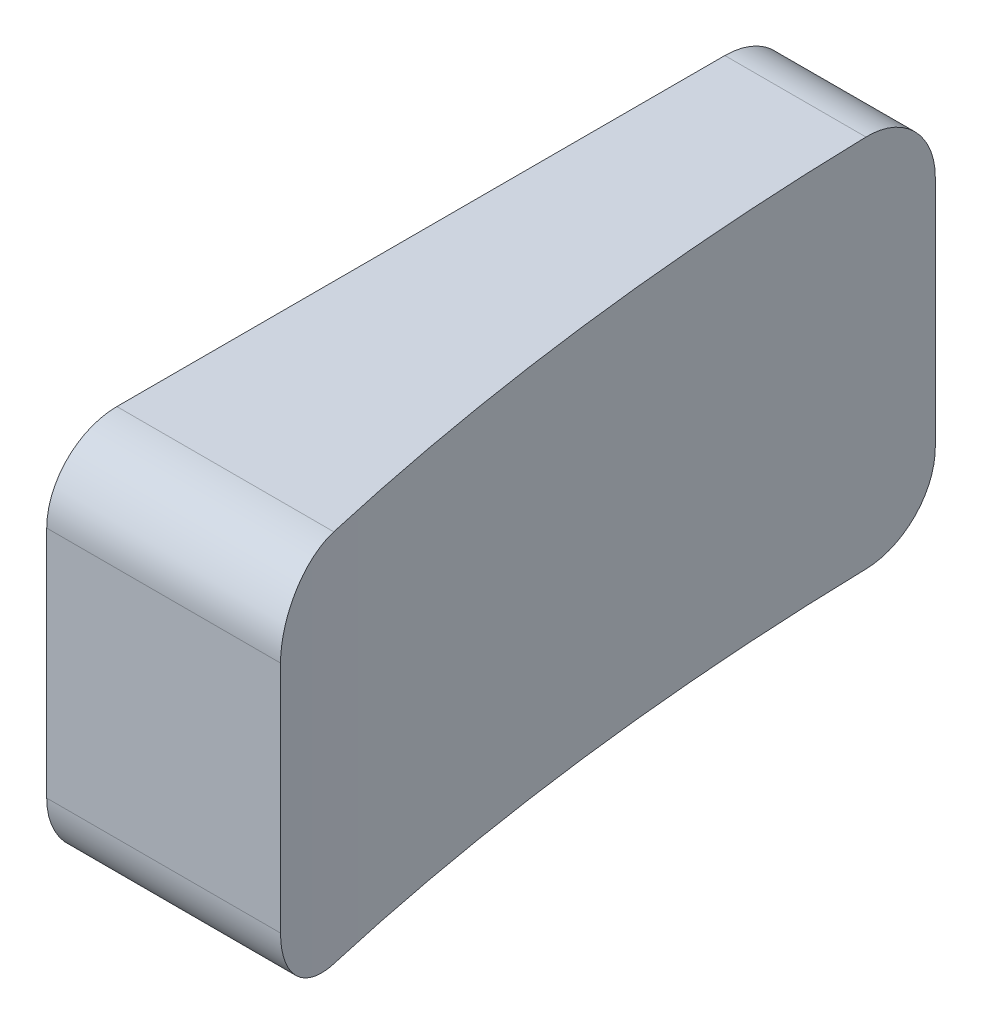
ISO-10303-21;
HEADER;
FILE_DESCRIPTION(('STEP AP214'),'2;1');
FILE_NAME('part.step','',(''),(''),'','','');
FILE_SCHEMA(('AUTOMOTIVE_DESIGN { 1 0 10303 214 1 1 1 1 }'));
ENDSEC;
DATA;
#1=APPLICATION_CONTEXT('core data for automotive mechanical design processes');
#2=APPLICATION_PROTOCOL_DEFINITION('international standard','automotive_design',2000,#1);
#3=PRODUCT_CONTEXT('',#1,'mechanical');
#4=PRODUCT('Part','Part','',(#3));
#5=PRODUCT_RELATED_PRODUCT_CATEGORY('part','',(#4));
#6=PRODUCT_DEFINITION_FORMATION('','',#4);
#7=PRODUCT_DEFINITION_CONTEXT('part definition',#1,'design');
#8=PRODUCT_DEFINITION('design','',#6,#7);
#9=PRODUCT_DEFINITION_SHAPE('','',#8);
#10=(LENGTH_UNIT() NAMED_UNIT(*) SI_UNIT(.MILLI.,.METRE.));
#11=(NAMED_UNIT(*) PLANE_ANGLE_UNIT() SI_UNIT($,.RADIAN.));
#12=(NAMED_UNIT(*) SI_UNIT($,.STERADIAN.) SOLID_ANGLE_UNIT());
#13=UNCERTAINTY_MEASURE_WITH_UNIT(LENGTH_MEASURE(1.E-05),#10,'distance_accuracy_value','');
#14=(GEOMETRIC_REPRESENTATION_CONTEXT(3) GLOBAL_UNCERTAINTY_ASSIGNED_CONTEXT((#13)) GLOBAL_UNIT_ASSIGNED_CONTEXT((#10,
#11,#12)) REPRESENTATION_CONTEXT('',''));
#15=CARTESIAN_POINT('',(0.,0.,0.));
#16=DIRECTION('',(0.,0.,1.));
#17=DIRECTION('',(1.,0.,0.));
#18=AXIS2_PLACEMENT_3D('',#15,#16,#17);
#19=CARTESIAN_POINT('',(0.,25.4,-25.4));
#20=DIRECTION('',(0.,0.,1.));
#21=DIRECTION('',(1.,0.,0.));
#22=AXIS2_PLACEMENT_3D('',#19,#20,#21);
#23=PLANE('',#22);
#24=DIRECTION('',(0.,-1.,0.));
#25=VECTOR('',#24,1.);
#26=CARTESIAN_POINT('',(9.52500000000001,25.4,-25.4));
#27=LINE('',#26,#25);
#28=CARTESIAN_POINT('',(9.52500000000001,20.6375,-25.4));
#29=VERTEX_POINT('',#28);
#30=CARTESIAN_POINT('',(9.52500000000001,4.7625,-25.4));
#31=VERTEX_POINT('',#30);
#32=EDGE_CURVE('E228',#29,#31,#27,.T.);
#33=ORIENTED_EDGE('',*,*,#32,.T.);
#34=DIRECTION('',(-1.,0.,0.));
#35=VECTOR('',#34,1.);
#36=CARTESIAN_POINT('',(0.,4.7625,-25.4));
#37=LINE('',#36,#35);
#38=CARTESIAN_POINT('',(0.,4.7625,-25.4));
#39=VERTEX_POINT('',#38);
#40=EDGE_CURVE('E136',#31,#39,#37,.T.);
#41=ORIENTED_EDGE('',*,*,#40,.T.);
#42=DIRECTION('',(0.,-1.,0.));
#43=VECTOR('',#42,1.);
#44=CARTESIAN_POINT('',(0.,25.4,-25.4));
#45=LINE('',#44,#43);
#46=CARTESIAN_POINT('',(0.,20.6375,-25.4));
#47=VERTEX_POINT('',#46);
#48=EDGE_CURVE('E120',#47,#39,#45,.T.);
#49=ORIENTED_EDGE('',*,*,#48,.F.);
#50=DIRECTION('',(-1.,0.,0.));
#51=VECTOR('',#50,1.);
#52=CARTESIAN_POINT('',(9.52500000000001,20.6375,-25.4));
#53=LINE('',#52,#51);
#54=EDGE_CURVE('E133',#47,#29,#53,.F.);
#55=ORIENTED_EDGE('',*,*,#54,.T.);
#56=EDGE_LOOP('',(#33,#41,#49,#55));
#57=FACE_BOUND('',#56,.T.);
#58=ADVANCED_FACE('F45',(#57),#23,.F.);
#59=CARTESIAN_POINT('',(0.,25.4,25.4));
#60=DIRECTION('',(1.,0.,0.));
#61=DIRECTION('',(0.,0.,-1.));
#62=AXIS2_PLACEMENT_3D('',#59,#60,#61);
#63=PLANE('',#62);
#64=ORIENTED_EDGE('',*,*,#48,.T.);
#65=CARTESIAN_POINT('',(0.,4.7625,-20.6375));
#66=DIRECTION('',(1.,0.,0.));
#67=DIRECTION('',(0.,0.,-1.));
#68=AXIS2_PLACEMENT_3D('',#65,#66,#67);
#69=CIRCLE('',#68,4.7625);
#70=CARTESIAN_POINT('',(0.,0.,-20.6375));
#71=VERTEX_POINT('',#70);
#72=EDGE_CURVE('E151',#39,#71,#69,.F.);
#73=ORIENTED_EDGE('',*,*,#72,.T.);
#74=DIRECTION('',(0.,0.,1.));
#75=VECTOR('',#74,1.);
#76=CARTESIAN_POINT('',(0.,0.,25.4));
#77=LINE('',#76,#75);
#78=CARTESIAN_POINT('',(0.,0.,20.6375));
#79=VERTEX_POINT('',#78);
#80=EDGE_CURVE('E237',#71,#79,#77,.T.);
#81=ORIENTED_EDGE('',*,*,#80,.T.);
#82=CARTESIAN_POINT('',(0.,4.7625,20.6375));
#83=DIRECTION('',(1.,0.,0.));
#84=DIRECTION('',(0.,0.,-1.));
#85=AXIS2_PLACEMENT_3D('',#82,#83,#84);
#86=CIRCLE('',#85,4.7625);
#87=CARTESIAN_POINT('',(0.,4.7625,25.4));
#88=VERTEX_POINT('',#87);
#89=EDGE_CURVE('E127',#79,#88,#86,.F.);
#90=ORIENTED_EDGE('',*,*,#89,.T.);
#91=DIRECTION('',(0.,-1.,0.));
#92=VECTOR('',#91,1.);
#93=CARTESIAN_POINT('',(0.,25.4,25.4));
#94=LINE('',#93,#92);
#95=CARTESIAN_POINT('',(0.,20.6375,25.4));
#96=VERTEX_POINT('',#95);
#97=EDGE_CURVE('E138',#96,#88,#94,.T.);
#98=ORIENTED_EDGE('',*,*,#97,.F.);
#99=CARTESIAN_POINT('',(0.,20.6375,20.6375));
#100=DIRECTION('',(1.,0.,0.));
#101=DIRECTION('',(0.,0.,-1.));
#102=AXIS2_PLACEMENT_3D('',#99,#100,#101);
#103=CIRCLE('',#102,4.7625);
#104=CARTESIAN_POINT('',(0.,25.4,20.6375));
#105=VERTEX_POINT('',#104);
#106=EDGE_CURVE('E128',#96,#105,#103,.F.);
#107=ORIENTED_EDGE('',*,*,#106,.T.);
#108=DIRECTION('',(0.,0.,1.));
#109=VECTOR('',#108,1.);
#110=CARTESIAN_POINT('',(0.,25.4,25.4));
#111=LINE('',#110,#109);
#112=CARTESIAN_POINT('',(0.,25.4,-20.6375));
#113=VERTEX_POINT('',#112);
#114=EDGE_CURVE('E122',#113,#105,#111,.T.);
#115=ORIENTED_EDGE('',*,*,#114,.F.);
#116=CARTESIAN_POINT('',(0.,20.6375,-20.6375));
#117=DIRECTION('',(1.,0.,0.));
#118=DIRECTION('',(0.,0.,-1.));
#119=AXIS2_PLACEMENT_3D('',#116,#117,#118);
#120=CIRCLE('',#119,4.7625);
#121=EDGE_CURVE('E117',#113,#47,#120,.F.);
#122=ORIENTED_EDGE('',*,*,#121,.T.);
#123=EDGE_LOOP('',(#64,#73,#81,#90,#98,#107,#115,#122));
#124=FACE_BOUND('',#123,.T.);
#125=ADVANCED_FACE('F119',(#124),#63,.F.);
#126=CARTESIAN_POINT('',(0.,25.4,25.4));
#127=DIRECTION('',(0.,0.,-1.));
#128=DIRECTION('',(-1.,0.,0.));
#129=AXIS2_PLACEMENT_3D('',#126,#127,#128);
#130=PLANE('',#129);
#131=ORIENTED_EDGE('',*,*,#97,.T.);
#132=DIRECTION('',(1.,0.,0.));
#133=VECTOR('',#132,1.);
#134=CARTESIAN_POINT('',(0.,4.7625,25.4));
#135=LINE('',#134,#133);
#136=CARTESIAN_POINT('',(15.875,4.7625,25.4));
#137=VERTEX_POINT('',#136);
#138=EDGE_CURVE('E218',#88,#137,#135,.T.);
#139=ORIENTED_EDGE('',*,*,#138,.T.);
#140=DIRECTION('',(0.,-1.,0.));
#141=VECTOR('',#140,1.);
#142=CARTESIAN_POINT('',(15.875,25.4,25.4));
#143=LINE('',#142,#141);
#144=CARTESIAN_POINT('',(15.875,20.6375,25.4));
#145=VERTEX_POINT('',#144);
#146=EDGE_CURVE('E222',#145,#137,#143,.T.);
#147=ORIENTED_EDGE('',*,*,#146,.F.);
#148=DIRECTION('',(1.,0.,0.));
#149=VECTOR('',#148,1.);
#150=CARTESIAN_POINT('',(0.,20.6375,25.4));
#151=LINE('',#150,#149);
#152=EDGE_CURVE('E220',#145,#96,#151,.F.);
#153=ORIENTED_EDGE('',*,*,#152,.T.);
#154=EDGE_LOOP('',(#131,#139,#147,#153));
#155=FACE_BOUND('',#154,.T.);
#156=ADVANCED_FACE('F174',(#155),#130,.F.);
#157=CARTESIAN_POINT('',(215.9,25.4,-25.4));
#158=DIRECTION('',(0.,-1.,0.));
#159=DIRECTION('',(0.,0.,-1.));
#160=AXIS2_PLACEMENT_3D('',#157,#158,#159);
#161=CYLINDRICAL_SURFACE('',#160,206.375);
#162=CARTESIAN_POINT('',(215.9,0.,-25.4));
#163=DIRECTION('',(0.,-1.,0.));
#164=DIRECTION('',(0.,0.,1.));
#165=AXIS2_PLACEMENT_3D('',#162,#163,#164);
#166=CIRCLE('',#165,206.375);
#167=CARTESIAN_POINT('',(14.725475721328,0.,20.6375));
#168=VERTEX_POINT('',#167);
#169=CARTESIAN_POINT('',(9.57995924111007,0.,-20.6375));
#170=VERTEX_POINT('',#169);
#171=EDGE_CURVE('E230',#168,#170,#166,.T.);
#172=ORIENTED_EDGE('',*,*,#171,.T.);
#173=CARTESIAN_POINT('',(9.57995924111007,0.,-20.6375));
#174=CARTESIAN_POINT('',(9.57686684509873,-1.44131667153116E-05,-20.7714111972111));
#175=CARTESIAN_POINT('',(9.57390744855058,0.00564733798363152,-20.9053235199688));
#176=CARTESIAN_POINT('',(9.56826717498214,0.0282206699912147,-21.1721965815908));
#177=CARTESIAN_POINT('',(9.56558628509452,0.045131730849215,-21.305157364153));
#178=CARTESIAN_POINT('',(9.56051716286694,0.0900843023540706,-21.5690868486602));
#179=CARTESIAN_POINT('',(9.55812871209274,0.118117438293346,-21.7000569726641));
#180=CARTESIAN_POINT('',(9.55364522199756,0.185111451043966,-21.9591751013205));
#181=CARTESIAN_POINT('',(9.55155017893187,0.224072188368946,-22.0873231419733));
#182=CARTESIAN_POINT('',(9.54764953222309,0.312660784965492,-22.3399269844478));
#183=CARTESIAN_POINT('',(9.5458440189197,0.362291962388078,-22.4643816240136));
#184=CARTESIAN_POINT('',(9.54251272655787,0.471882171236291,-22.7087167280851));
#185=CARTESIAN_POINT('',(9.54098705115725,0.531845013840155,-22.8285954846197));
#186=CARTESIAN_POINT('',(9.53820147587904,0.661624264907152,-23.0628123013234));
#187=CARTESIAN_POINT('',(9.53694143083886,0.731435256518621,-23.1771533612979));
#188=CARTESIAN_POINT('',(9.53466527961651,0.880467233471503,-23.3995928415555));
#189=CARTESIAN_POINT('',(9.53364926345364,0.959691675261433,-23.5076889470175));
#190=CARTESIAN_POINT('',(9.53183800514419,1.12692314095652,-23.7167690839712));
#191=CARTESIAN_POINT('',(9.53104264849187,1.21492557738439,-23.8177567838111));
#192=CARTESIAN_POINT('',(9.52964476214653,1.39915659628471,-24.0120002521264));
#193=CARTESIAN_POINT('',(9.52904230438652,1.49538823055765,-24.1052531266629));
#194=CARTESIAN_POINT('',(9.52800202407359,1.69534850789894,-24.2833067370036));
#195=CARTESIAN_POINT('',(9.52756417402915,1.79907589563131,-24.3681088824432));
#196=CARTESIAN_POINT('',(9.52682363774841,2.01334272149386,-24.5287044809492));
#197=CARTESIAN_POINT('',(9.52652099964152,2.12388456935996,-24.6044947191453));
#198=CARTESIAN_POINT('',(9.52602246368339,2.35097000077036,-24.7464978599253));
#199=CARTESIAN_POINT('',(9.52582657404341,2.46751404525826,-24.8127100254615));
#200=CARTESIAN_POINT('',(9.52551461220124,2.70576592413184,-24.9350792304566));
#201=CARTESIAN_POINT('',(9.52539854034662,2.8274737810009,-24.9912362261295));
#202=CARTESIAN_POINT('',(9.52522195007286,3.07513402459318,-25.0930713401954));
#203=CARTESIAN_POINT('',(9.52516140501441,3.20108434586802,-25.1387544755887));
#204=CARTESIAN_POINT('',(9.52507515414587,3.4563382689145,-25.219341083502));
#205=CARTESIAN_POINT('',(9.52504944076062,3.58564113534149,-25.2542468985887));
#206=CARTESIAN_POINT('',(9.52501092363945,3.88784963708841,-25.3222953631396));
#207=CARTESIAN_POINT('',(9.52500472010514,4.06168311508259,-25.3514335641022));
#208=CARTESIAN_POINT('',(9.52500072477052,4.32383255864476,-25.3805700696062));
#209=CARTESIAN_POINT('',(9.52500027689242,4.41140503849135,-25.3878537657823));
#210=CARTESIAN_POINT('',(9.52499998055014,4.58681115545222,-25.3975680872597));
#211=CARTESIAN_POINT('',(9.52500013203382,4.67464476919362,-25.3999991345362));
#212=CARTESIAN_POINT('',(9.525,4.7625,-25.4));
#213=B_SPLINE_CURVE_WITH_KNOTS('',3,(#173,#174,#175,#176,#177,#178,#179,#180,#181,#182,#183,
#184,#185,#186,#187,#188,#189,#190,#191,#192,#193,#194,#195,#196,#197,#198,#199,#200,#201,#202,
#203,#204,#205,#206,#207,#208,#209,#210,#211,#212),.UNSPECIFIED.,.F.,.F.,(4,2,2,2,2,2,2,2,2,2,2,
2,2,2,2,2,2,2,2,4),(0.,0.401718290437494,0.803418012741041,1.20481583523418,1.60620853428131,
2.00772623407758,2.40939236537372,2.81083842045904,3.21243233744908,3.61381746581599,
4.01535209892786,4.41681964100082,4.8184299739631,5.2200711950423,5.62171416505721,
6.0231643434478,6.42452720078254,6.95207450442178,7.21558634402556,7.47907526824601),.UNSPECIFIED.);
#214=EDGE_CURVE('E187',#170,#31,#213,.T.);
#215=ORIENTED_EDGE('',*,*,#214,.T.);
#216=ORIENTED_EDGE('',*,*,#32,.F.);
#217=CARTESIAN_POINT('',(9.52500000000001,20.6375,-25.4));
#218=CARTESIAN_POINT('',(9.52500098249819,20.7714496328126,-25.4000144037189));
#219=CARTESIAN_POINT('',(9.52500003085494,20.9053971982932,-25.3943494222169));
#220=CARTESIAN_POINT('',(9.52500136008713,21.1723339792325,-25.3717647199799));
#221=CARTESIAN_POINT('',(9.52500364080759,21.3053232403307,-25.3548455388586));
#222=CARTESIAN_POINT('',(9.52501852868306,21.5693026071891,-25.3098734209009));
#223=CARTESIAN_POINT('',(9.5250311280461,21.7002941454984,-25.2818288934528));
#224=CARTESIAN_POINT('',(9.52508035337528,21.9594489151736,-25.214810089648));
#225=CARTESIAN_POINT('',(9.52511697904812,22.0876121810455,-25.1758359467166));
#226=CARTESIAN_POINT('',(9.5252322747876,22.3402397527369,-25.0872199991321));
#227=CARTESIAN_POINT('',(9.52531095758247,22.4647029267104,-25.0375749677442));
#228=CARTESIAN_POINT('',(9.52553257650581,22.7090503172533,-24.9279571301759));
#229=CARTESIAN_POINT('',(9.52567553637437,22.8289328242337,-24.8679805131819));
#230=CARTESIAN_POINT('',(9.52605101501913,23.0631535039288,-24.7381741993136));
#231=CARTESIAN_POINT('',(9.52628348493963,23.1774946629171,-24.6683498905844));
#232=CARTESIAN_POINT('',(9.5268657671709,23.3999310591723,-24.5192923017632));
#233=CARTESIAN_POINT('',(9.52721562266789,23.5080239805276,-24.4400555657759));
#234=CARTESIAN_POINT('',(9.52806146664241,23.7171073787956,-24.2727910183958));
#235=CARTESIAN_POINT('',(9.5285573962795,23.818100695265,-24.1847667561457));
#236=CARTESIAN_POINT('',(9.52972478527153,24.0123512538497,-24.0004919036527));
#237=CARTESIAN_POINT('',(9.53039630994635,24.1056056000916,-23.9042382611366));
#238=CARTESIAN_POINT('',(9.53194287430899,24.2836578398124,-23.704234775687));
#239=CARTESIAN_POINT('',(9.53281787934175,24.368457169769,-23.6004862112974));
#240=CARTESIAN_POINT('',(9.53479791378592,24.5290432439461,-23.3861783836577));
#241=CARTESIAN_POINT('',(9.53590302488274,24.6048267725924,-23.2756167116602));
#242=CARTESIAN_POINT('',(9.53836592262524,24.7468017371941,-23.0485116205456));
#243=CARTESIAN_POINT('',(9.53972368947454,24.8129939239389,-22.9319686705982));
#244=CARTESIAN_POINT('',(9.54271060384272,24.9353229572301,-22.6937239215428));
#245=CARTESIAN_POINT('',(9.54433975252166,24.9914597607912,-22.5720221003842));
#246=CARTESIAN_POINT('',(9.54788224426098,25.0932551358606,-22.3243793476533));
#247=CARTESIAN_POINT('',(9.54979545120617,25.1389186994176,-22.1984404686286));
#248=CARTESIAN_POINT('',(9.55391312036062,25.2194676084947,-21.9432158025382));
#249=CARTESIAN_POINT('',(9.55611751912747,25.2543552962599,-21.813930749428));
#250=CARTESIAN_POINT('',(9.56155983768929,25.3223588547571,-21.5117982643231));
#251=CARTESIAN_POINT('',(9.56490487303964,25.3514741950914,-21.3380262179144));
#252=CARTESIAN_POINT('',(9.57028541733064,25.380586884232,-21.0759786095743));
#253=CARTESIAN_POINT('',(9.57213841516752,25.3878643878059,-20.9884418628921));
#254=CARTESIAN_POINT('',(9.57596175412897,25.3975703012606,-20.8131101536744));
#255=CARTESIAN_POINT('',(9.57793208497226,25.3999991353628,-20.7253152144018));
#256=CARTESIAN_POINT('',(9.57995924111009,25.4,-20.6375));
#257=B_SPLINE_CURVE_WITH_KNOTS('',3,(#217,#218,#219,#220,#221,#222,#223,#224,#225,#226,#227,
#228,#229,#230,#231,#232,#233,#234,#235,#236,#237,#238,#239,#240,#241,#242,#243,#244,#245,#246,
#247,#248,#249,#250,#251,#252,#253,#254,#255,#256),.UNSPECIFIED.,.F.,.F.,(4,2,2,2,2,2,2,2,2,2,2,
2,2,2,2,2,2,2,2,4),(0.,0.40172624545447,0.803433230419577,1.20483715128862,1.60623617215764,
2.00775674194347,2.40942573128465,2.81087579474993,3.21247371410221,3.61391008562868,
4.01549600105346,4.41701357176144,4.81867392104306,5.22030281221816,5.62193342025598,
6.02337219217315,6.42472364582371,6.95217389488428,7.21563610135604,7.47907525589603),.UNSPECIFIED.);
#258=CARTESIAN_POINT('',(9.57995924111007,25.4,-20.6375));
#259=VERTEX_POINT('',#258);
#260=EDGE_CURVE('E142',#29,#259,#257,.T.);
#261=ORIENTED_EDGE('',*,*,#260,.T.);
#262=CARTESIAN_POINT('',(215.9,25.4,-25.4));
#263=DIRECTION('',(0.,-1.,0.));
#264=DIRECTION('',(0.,0.,1.));
#265=AXIS2_PLACEMENT_3D('',#262,#263,#264);
#266=CIRCLE('',#265,206.375);
#267=CARTESIAN_POINT('',(14.725475721328,25.4,20.6375));
#268=VERTEX_POINT('',#267);
#269=EDGE_CURVE('E233',#268,#259,#266,.T.);
#270=ORIENTED_EDGE('',*,*,#269,.F.);
#271=CARTESIAN_POINT('',(14.725475721328,25.4,20.6375));
#272=CARTESIAN_POINT('',(14.7568199239297,25.4000124453675,20.7744742327743));
#273=CARTESIAN_POINT('',(14.7883062541593,25.3940912639117,20.9114135705848));
#274=CARTESIAN_POINT('',(14.8513322739844,25.370488281903,21.1842599607082));
#275=CARTESIAN_POINT('',(14.8828719624886,25.3528067190446,21.3201670338286));
#276=CARTESIAN_POINT('',(14.9457720605345,25.3057918639937,21.5899790244483));
#277=CARTESIAN_POINT('',(14.9771324870441,25.2764596937502,21.723884133448));
#278=CARTESIAN_POINT('',(15.0394392869678,25.2063376272899,21.9887568357521));
#279=CARTESIAN_POINT('',(15.0703856665755,25.1655479026652,22.1197244730175));
#280=CARTESIAN_POINT('',(15.1316373903306,25.0727466041071,22.3778485035391));
#281=CARTESIAN_POINT('',(15.1619424353543,25.020729915199,22.5050031294235));
#282=CARTESIAN_POINT('',(15.2216626968035,24.905793074041,22.7545639698923));
#283=CARTESIAN_POINT('',(15.2510775802578,24.8428688995649,22.876968412356));
#284=CARTESIAN_POINT('',(15.3087391775749,24.7065762212576,23.1159954441266));
#285=CARTESIAN_POINT('',(15.336986657292,24.6332147096578,23.2326218343363));
#286=CARTESIAN_POINT('',(15.3920968891976,24.4764619054928,23.459339245259));
#287=CARTESIAN_POINT('',(15.41895916696,24.3930672087703,23.5694280287993));
#288=CARTESIAN_POINT('',(15.4707808038715,24.2177082412474,23.7810987374914));
#289=CARTESIAN_POINT('',(15.4957566302052,24.1258389392554,23.8827552959953));
#290=CARTESIAN_POINT('',(15.5438684286492,23.9334417332589,24.0779878008191));
#291=CARTESIAN_POINT('',(15.567004451907,23.8329140701225,24.1715639717834));
#292=CARTESIAN_POINT('',(15.6112208952802,23.6238468702292,24.3499149441193));
#293=CARTESIAN_POINT('',(15.6323005841819,23.515304507449,24.4346866153795));
#294=CARTESIAN_POINT('',(15.6721745693742,23.2910461240193,24.5946531499051));
#295=CARTESIAN_POINT('',(15.6909697705824,23.1753329714248,24.6698518057395));
#296=CARTESIAN_POINT('',(15.7256317813676,22.9406211046666,24.8082452571475));
#297=CARTESIAN_POINT('',(15.7415618997894,22.8217854478245,24.871700805323));
#298=CARTESIAN_POINT('',(15.7709067203663,22.5789592303267,24.9883941769082));
#299=CARTESIAN_POINT('',(15.78432246046,22.4549708226714,25.0416362166818));
#300=CARTESIAN_POINT('',(15.8084965760326,22.2027745209286,25.1374448112002));
#301=CARTESIAN_POINT('',(15.8192566602297,22.0745694004886,25.1800182306855));
#302=CARTESIAN_POINT('',(15.8380116679163,21.8148645299299,25.2541498658498));
#303=CARTESIAN_POINT('',(15.8460074933859,21.683365869545,25.2857116746584));
#304=CARTESIAN_POINT('',(15.8600199926241,21.400398277682,25.3409893706714));
#305=CARTESIAN_POINT('',(15.8656333028568,21.248594631926,25.3631086027043));
#306=CARTESIAN_POINT('',(15.8731257202365,20.9436915263925,25.3926197926957));
#307=CARTESIAN_POINT('',(15.8750101418271,20.7905942235461,25.4000327102562));
#308=CARTESIAN_POINT('',(15.875,20.6375,25.4));
#309=B_SPLINE_CURVE_WITH_KNOTS('',3,(#271,#272,#273,#274,#275,#276,#277,#278,#279,#280,#281,
#282,#283,#284,#285,#286,#287,#288,#289,#290,#291,#292,#293,#294,#295,#296,#297,#298,#299,#300,
#301,#302,#303,#304,#305,#306,#307,#308),.UNSPECIFIED.,.F.,.F.,(4,2,2,2,2,2,2,2,2,2,2,2,2,2,2,2,
2,2,4),(0.,0.421416436747361,0.842824356310641,1.26419170429025,1.68555274207055,
2.10710615756492,2.52881535638369,2.9502433605036,3.37181475623923,3.78913202165789,
4.20643768141844,4.62389119443793,5.04117880558093,5.44764339700889,5.85393982797871,
6.25997415168269,6.66587586068722,7.12563372861935,7.58473587246938),.UNSPECIFIED.);
#310=EDGE_CURVE('E70',#268,#145,#309,.T.);
#311=ORIENTED_EDGE('',*,*,#310,.T.);
#312=ORIENTED_EDGE('',*,*,#146,.T.);
#313=CARTESIAN_POINT('',(15.875,4.7625,25.4));
#314=CARTESIAN_POINT('',(15.8750051657812,4.63145166147308,25.4000164631992));
#315=CARTESIAN_POINT('',(15.8736264904115,4.50040705319955,25.3945916881294));
#316=CARTESIAN_POINT('',(15.8681390415241,4.23928050301967,25.3729795850089));
#317=CARTESIAN_POINT('',(15.8640305824512,4.10919845198079,25.3567934965584));
#318=CARTESIAN_POINT('',(15.8531301364182,3.85113472489456,25.3138141336712));
#319=CARTESIAN_POINT('',(15.8463425893672,3.72314993681746,25.2870384087268));
#320=CARTESIAN_POINT('',(15.8301559179084,3.46996894065687,25.223109420648));
#321=CARTESIAN_POINT('',(15.8207567911391,3.34477273509507,25.1859561481298));
#322=CARTESIAN_POINT('',(15.7994429420248,3.09804983283013,25.1015799698088));
#323=CARTESIAN_POINT('',(15.7875283437332,2.97652295550741,25.0543575605762));
#324=CARTESIAN_POINT('',(15.7612973710692,2.73791940968497,24.9502057454655));
#325=CARTESIAN_POINT('',(15.7469801106097,2.62084440261786,24.8932727582589));
#326=CARTESIAN_POINT('',(15.7160906813957,2.39200949347217,24.7701813627478));
#327=CARTESIAN_POINT('',(15.6995192088058,2.28024796476468,24.7040258024799));
#328=CARTESIAN_POINT('',(15.6642675126467,2.06268756966812,24.562959737898));
#329=CARTESIAN_POINT('',(15.6455865015986,1.95689095218934,24.4880459638211));
#330=CARTESIAN_POINT('',(15.6060227450229,1.75057722200665,24.3289664688798));
#331=CARTESIAN_POINT('',(15.5851134780891,1.65015163800168,24.2446886367757));
#332=CARTESIAN_POINT('',(15.5414892402834,1.45675942583773,24.068333770988));
#333=CARTESIAN_POINT('',(15.5187736059343,1.36379556378944,23.9762538707902));
#334=CARTESIAN_POINT('',(15.4717414215233,1.18594565961753,23.7849923473274));
#335=CARTESIAN_POINT('',(15.4474250896272,1.10105852052361,23.6858116916939));
#336=CARTESIAN_POINT('',(15.3973915973122,0.939842195082994,23.4810371624753));
#337=CARTESIAN_POINT('',(15.371673929538,0.863516139288222,23.3754409645229));
#338=CARTESIAN_POINT('',(15.2912308788336,0.644017653139489,23.0439347694182));
#339=CARTESIAN_POINT('',(15.2345393120421,0.515321904105699,22.808675845778));
#340=CARTESIAN_POINT('',(15.1179480134937,0.299400662280885,22.3207621158874));
#341=CARTESIAN_POINT('',(15.0580490763011,0.212164950963184,22.0681116136782));
#342=CARTESIAN_POINT('',(14.9524146105472,0.0979548408888346,21.6185841432081));
#343=CARTESIAN_POINT('',(14.9069930859987,0.0612572200034773,21.4240505959284));
#344=CARTESIAN_POINT('',(14.8161107132705,0.0122760072266921,21.0322201859171));
#345=CARTESIAN_POINT('',(14.7706499971804,-3.9905769789297E-05,20.8349273310882));
#346=CARTESIAN_POINT('',(14.725475721328,0.,20.6375));
#347=B_SPLINE_CURVE_WITH_KNOTS('',3,(#313,#314,#315,#316,#317,#318,#319,#320,#321,#322,#323,
#324,#325,#326,#327,#328,#329,#330,#331,#332,#333,#334,#335,#336,#337,#338,#339,#340,#341,#342,
#343,#344,#345,#346),.UNSPECIFIED.,.F.,.F.,(4,2,2,2,2,2,2,2,2,2,2,2,2,2,2,2,4),(0.,
0.393019963933574,0.785994663572618,1.17832082340625,1.57064733800306,1.96295450907093,
2.35540667983732,2.74773792422703,3.14021611085638,3.53803966311987,3.93601001660133,
4.3339262408635,4.73198750097393,5.55020106303643,6.36821285783009,6.97610711859524,
7.58319499590368),.UNSPECIFIED.);
#348=EDGE_CURVE('E62',#137,#168,#347,.T.);
#349=ORIENTED_EDGE('',*,*,#348,.T.);
#350=EDGE_LOOP('',(#172,#215,#216,#261,#270,#311,#312,#349));
#351=FACE_BOUND('',#350,.T.);
#352=ADVANCED_FACE('F168',(#351),#161,.F.);
#353=CARTESIAN_POINT('',(215.9,25.4,-25.4));
#354=DIRECTION('',(0.,1.,0.));
#355=DIRECTION('',(0.,0.,1.));
#356=AXIS2_PLACEMENT_3D('',#353,#354,#355);
#357=PLANE('',#356);
#358=ORIENTED_EDGE('',*,*,#269,.T.);
#359=DIRECTION('',(-1.,0.,0.));
#360=VECTOR('',#359,1.);
#361=CARTESIAN_POINT('',(0.,25.4,-20.6375));
#362=LINE('',#361,#360);
#363=EDGE_CURVE('E11',#259,#113,#362,.T.);
#364=ORIENTED_EDGE('',*,*,#363,.T.);
#365=ORIENTED_EDGE('',*,*,#114,.T.);
#366=DIRECTION('',(1.,0.,0.));
#367=VECTOR('',#366,1.);
#368=CARTESIAN_POINT('',(15.875,25.4,20.6375));
#369=LINE('',#368,#367);
#370=EDGE_CURVE('E55',#105,#268,#369,.T.);
#371=ORIENTED_EDGE('',*,*,#370,.T.);
#372=EDGE_LOOP('',(#358,#364,#365,#371));
#373=FACE_BOUND('',#372,.T.);
#374=ADVANCED_FACE('F173',(#373),#357,.T.);
#375=CARTESIAN_POINT('',(215.9,0.,-25.4));
#376=DIRECTION('',(0.,1.,0.));
#377=DIRECTION('',(0.,0.,1.));
#378=AXIS2_PLACEMENT_3D('',#375,#376,#377);
#379=PLANE('',#378);
#380=ORIENTED_EDGE('',*,*,#80,.F.);
#381=DIRECTION('',(-1.,0.,0.));
#382=VECTOR('',#381,1.);
#383=CARTESIAN_POINT('',(215.9,0.,-20.6375));
#384=LINE('',#383,#382);
#385=EDGE_CURVE('E155',#71,#170,#384,.F.);
#386=ORIENTED_EDGE('',*,*,#385,.T.);
#387=ORIENTED_EDGE('',*,*,#171,.F.);
#388=DIRECTION('',(1.,0.,0.));
#389=VECTOR('',#388,1.);
#390=CARTESIAN_POINT('',(215.9,0.,20.6375));
#391=LINE('',#390,#389);
#392=EDGE_CURVE('E153',#168,#79,#391,.F.);
#393=ORIENTED_EDGE('',*,*,#392,.T.);
#394=EDGE_LOOP('',(#380,#386,#387,#393));
#395=FACE_BOUND('',#394,.T.);
#396=ADVANCED_FACE('F175',(#395),#379,.F.);
#397=CARTESIAN_POINT('',(0.,4.7625,-20.6375));
#398=DIRECTION('',(-1.,0.,0.));
#399=DIRECTION('',(0.,0.,1.));
#400=AXIS2_PLACEMENT_3D('',#397,#398,#399);
#401=CYLINDRICAL_SURFACE('',#400,4.7625);
#402=ORIENTED_EDGE('',*,*,#214,.F.);
#403=ORIENTED_EDGE('',*,*,#385,.F.);
#404=ORIENTED_EDGE('',*,*,#72,.F.);
#405=ORIENTED_EDGE('',*,*,#40,.F.);
#406=EDGE_LOOP('',(#402,#403,#404,#405));
#407=FACE_BOUND('',#406,.T.);
#408=ADVANCED_FACE('F197',(#407),#401,.T.);
#409=CARTESIAN_POINT('',(0.,4.7625,20.6375));
#410=DIRECTION('',(1.,0.,0.));
#411=DIRECTION('',(0.,0.,-1.));
#412=AXIS2_PLACEMENT_3D('',#409,#410,#411);
#413=CYLINDRICAL_SURFACE('',#412,4.7625);
#414=ORIENTED_EDGE('',*,*,#89,.F.);
#415=ORIENTED_EDGE('',*,*,#392,.F.);
#416=ORIENTED_EDGE('',*,*,#348,.F.);
#417=ORIENTED_EDGE('',*,*,#138,.F.);
#418=EDGE_LOOP('',(#414,#415,#416,#417));
#419=FACE_BOUND('',#418,.T.);
#420=ADVANCED_FACE('F194',(#419),#413,.T.);
#421=CARTESIAN_POINT('',(215.9,20.6375,-20.6375));
#422=DIRECTION('',(1.,0.,0.));
#423=DIRECTION('',(0.,0.,-1.));
#424=AXIS2_PLACEMENT_3D('',#421,#422,#423);
#425=CYLINDRICAL_SURFACE('',#424,4.7625);
#426=ORIENTED_EDGE('',*,*,#260,.F.);
#427=ORIENTED_EDGE('',*,*,#54,.F.);
#428=ORIENTED_EDGE('',*,*,#121,.F.);
#429=ORIENTED_EDGE('',*,*,#363,.F.);
#430=EDGE_LOOP('',(#426,#427,#428,#429));
#431=FACE_BOUND('',#430,.T.);
#432=ADVANCED_FACE('F141',(#431),#425,.T.);
#433=CARTESIAN_POINT('',(215.9,20.6375,20.6375));
#434=DIRECTION('',(-1.,0.,0.));
#435=DIRECTION('',(0.,0.,1.));
#436=AXIS2_PLACEMENT_3D('',#433,#434,#435);
#437=CYLINDRICAL_SURFACE('',#436,4.7625);
#438=ORIENTED_EDGE('',*,*,#106,.F.);
#439=ORIENTED_EDGE('',*,*,#152,.F.);
#440=ORIENTED_EDGE('',*,*,#310,.F.);
#441=ORIENTED_EDGE('',*,*,#370,.F.);
#442=EDGE_LOOP('',(#438,#439,#440,#441));
#443=FACE_BOUND('',#442,.T.);
#444=ADVANCED_FACE('F47',(#443),#437,.T.);
#445=CLOSED_SHELL('',(#58,#125,#156,#352,#374,#396,#408,#420,#432,#444));
#446=MANIFOLD_SOLID_BREP('B2',#445);
#447=ADVANCED_BREP_SHAPE_REPRESENTATION('',(#18,#446),#14);
#448=SHAPE_DEFINITION_REPRESENTATION(#9,#447);
ENDSEC;
END-ISO-10303-21;
